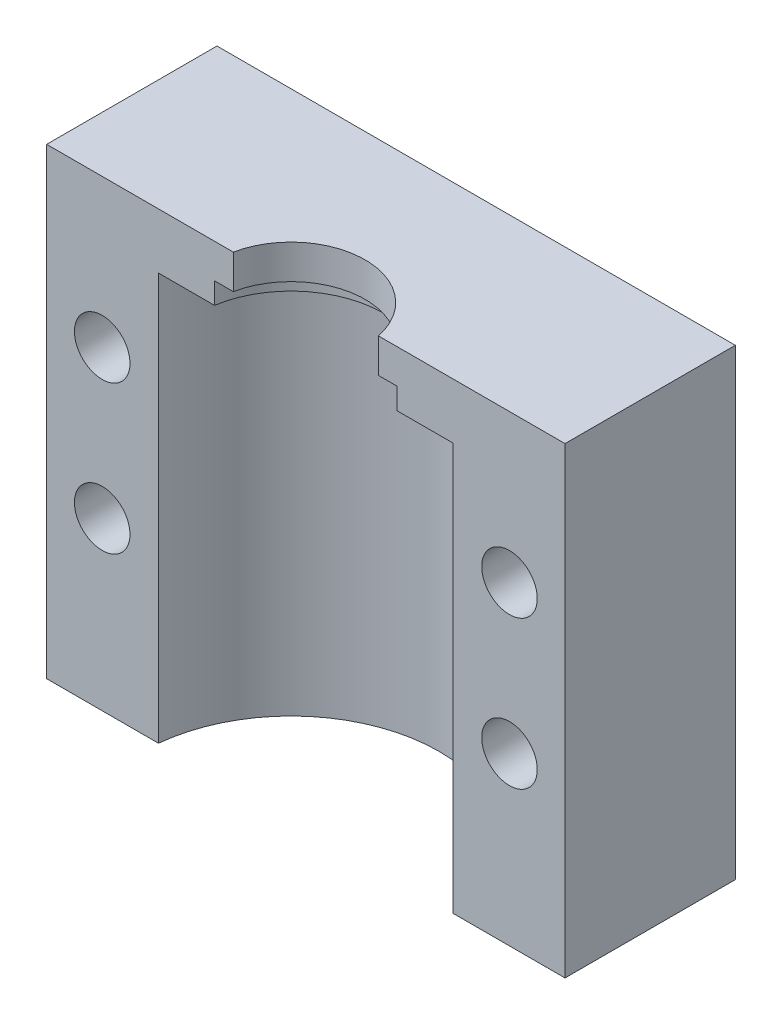
ISO-10303-21;
HEADER;
FILE_DESCRIPTION(('STEP AP214'),'2;1');
FILE_NAME('part.step','',(''),(''),'','','');
FILE_SCHEMA(('AUTOMOTIVE_DESIGN { 1 0 10303 214 1 1 1 1 }'));
ENDSEC;
DATA;
#1=APPLICATION_CONTEXT('core data for automotive mechanical design processes');
#2=APPLICATION_PROTOCOL_DEFINITION('international standard','automotive_design',2000,#1);
#3=PRODUCT_CONTEXT('',#1,'mechanical');
#4=PRODUCT('Part','Part','',(#3));
#5=PRODUCT_RELATED_PRODUCT_CATEGORY('part','',(#4));
#6=PRODUCT_DEFINITION_FORMATION('','',#4);
#7=PRODUCT_DEFINITION_CONTEXT('part definition',#1,'design');
#8=PRODUCT_DEFINITION('design','',#6,#7);
#9=PRODUCT_DEFINITION_SHAPE('','',#8);
#10=(LENGTH_UNIT() NAMED_UNIT(*) SI_UNIT(.MILLI.,.METRE.));
#11=(NAMED_UNIT(*) PLANE_ANGLE_UNIT() SI_UNIT($,.RADIAN.));
#12=(NAMED_UNIT(*) SI_UNIT($,.STERADIAN.) SOLID_ANGLE_UNIT());
#13=UNCERTAINTY_MEASURE_WITH_UNIT(LENGTH_MEASURE(1.E-05),#10,'distance_accuracy_value','');
#14=(GEOMETRIC_REPRESENTATION_CONTEXT(3) GLOBAL_UNCERTAINTY_ASSIGNED_CONTEXT((#13)) GLOBAL_UNIT_ASSIGNED_CONTEXT((#10,
#11,#12)) REPRESENTATION_CONTEXT('',''));
#15=CARTESIAN_POINT('',(0.,0.,0.));
#16=DIRECTION('',(0.,0.,1.));
#17=DIRECTION('',(1.,0.,0.));
#18=AXIS2_PLACEMENT_3D('',#15,#16,#17);
#19=CARTESIAN_POINT('',(0.,0.,10.));
#20=DIRECTION('',(1.,0.,0.));
#21=DIRECTION('',(0.,0.,-1.));
#22=AXIS2_PLACEMENT_3D('',#19,#20,#21);
#23=PLANE('',#22);
#24=DIRECTION('',(0.,-1.,0.));
#25=VECTOR('',#24,1.);
#26=CARTESIAN_POINT('',(0.,25.,9.2));
#27=LINE('',#26,#25);
#28=CARTESIAN_POINT('',(0.,25.,9.2));
#29=VERTEX_POINT('',#28);
#30=CARTESIAN_POINT('',(0.,0.,9.2));
#31=VERTEX_POINT('',#30);
#32=EDGE_CURVE('E116',#29,#31,#27,.T.);
#33=ORIENTED_EDGE('',*,*,#32,.F.);
#34=DIRECTION('',(0.,0.,-1.));
#35=VECTOR('',#34,1.);
#36=CARTESIAN_POINT('',(0.,25.,10.));
#37=LINE('',#36,#35);
#38=CARTESIAN_POINT('',(0.,25.,0.));
#39=VERTEX_POINT('',#38);
#40=EDGE_CURVE('E145',#29,#39,#37,.T.);
#41=ORIENTED_EDGE('',*,*,#40,.T.);
#42=DIRECTION('',(0.,-1.,0.));
#43=VECTOR('',#42,1.);
#44=CARTESIAN_POINT('',(0.,0.,0.));
#45=LINE('',#44,#43);
#46=CARTESIAN_POINT('',(0.,0.,0.));
#47=VERTEX_POINT('',#46);
#48=EDGE_CURVE('E140',#39,#47,#45,.T.);
#49=ORIENTED_EDGE('',*,*,#48,.T.);
#50=DIRECTION('',(0.,0.,-1.));
#51=VECTOR('',#50,1.);
#52=CARTESIAN_POINT('',(0.,0.,10.));
#53=LINE('',#52,#51);
#54=EDGE_CURVE('E131',#31,#47,#53,.T.);
#55=ORIENTED_EDGE('',*,*,#54,.F.);
#56=EDGE_LOOP('',(#33,#41,#49,#55));
#57=FACE_BOUND('',#56,.T.);
#58=ADVANCED_FACE('F39',(#57),#23,.F.);
#59=CARTESIAN_POINT('',(0.,0.,10.));
#60=DIRECTION('',(0.,1.,0.));
#61=DIRECTION('',(0.,0.,1.));
#62=AXIS2_PLACEMENT_3D('',#59,#60,#61);
#63=PLANE('',#62);
#64=DIRECTION('',(1.,0.,0.));
#65=VECTOR('',#64,1.);
#66=CARTESIAN_POINT('',(0.,0.,9.2));
#67=LINE('',#66,#65);
#68=CARTESIAN_POINT('',(6.04010050314704,0.,9.2));
#69=VERTEX_POINT('',#68);
#70=EDGE_CURVE('E119',#31,#69,#67,.T.);
#71=ORIENTED_EDGE('',*,*,#70,.F.);
#72=ORIENTED_EDGE('',*,*,#54,.T.);
#73=DIRECTION('',(1.,0.,0.));
#74=VECTOR('',#73,1.);
#75=CARTESIAN_POINT('',(0.,0.,0.));
#76=LINE('',#75,#74);
#77=CARTESIAN_POINT('',(28.,0.,0.));
#78=VERTEX_POINT('',#77);
#79=EDGE_CURVE('E141',#47,#78,#76,.T.);
#80=ORIENTED_EDGE('',*,*,#79,.T.);
#81=DIRECTION('',(0.,0.,-1.));
#82=VECTOR('',#81,1.);
#83=CARTESIAN_POINT('',(28.,0.,10.));
#84=LINE('',#83,#82);
#85=CARTESIAN_POINT('',(28.,0.,9.2));
#86=VERTEX_POINT('',#85);
#87=EDGE_CURVE('E151',#86,#78,#84,.T.);
#88=ORIENTED_EDGE('',*,*,#87,.F.);
#89=CARTESIAN_POINT('',(21.959899496853,0.,9.2));
#90=VERTEX_POINT('',#89);
#91=EDGE_CURVE('E126',#90,#86,#67,.T.);
#92=ORIENTED_EDGE('',*,*,#91,.F.);
#93=CARTESIAN_POINT('',(14.,0.,10.));
#94=DIRECTION('',(0.,1.,0.));
#95=DIRECTION('',(0.,0.,1.));
#96=AXIS2_PLACEMENT_3D('',#93,#94,#95);
#97=CIRCLE('',#96,8.);
#98=EDGE_CURVE('E135',#90,#69,#97,.T.);
#99=ORIENTED_EDGE('',*,*,#98,.T.);
#100=EDGE_LOOP('',(#71,#72,#80,#88,#92,#99));
#101=FACE_BOUND('',#100,.T.);
#102=ADVANCED_FACE('F41',(#101),#63,.F.);
#103=CARTESIAN_POINT('',(28.,0.,10.));
#104=DIRECTION('',(-1.,0.,0.));
#105=DIRECTION('',(0.,0.,1.));
#106=AXIS2_PLACEMENT_3D('',#103,#104,#105);
#107=PLANE('',#106);
#108=DIRECTION('',(0.,1.,0.));
#109=VECTOR('',#108,1.);
#110=CARTESIAN_POINT('',(28.,25.,9.2));
#111=LINE('',#110,#109);
#112=CARTESIAN_POINT('',(28.,25.,9.2));
#113=VERTEX_POINT('',#112);
#114=EDGE_CURVE('E136',#86,#113,#111,.T.);
#115=ORIENTED_EDGE('',*,*,#114,.F.);
#116=ORIENTED_EDGE('',*,*,#87,.T.);
#117=DIRECTION('',(0.,1.,0.));
#118=VECTOR('',#117,1.);
#119=CARTESIAN_POINT('',(28.,0.,0.));
#120=LINE('',#119,#118);
#121=CARTESIAN_POINT('',(28.,25.,0.));
#122=VERTEX_POINT('',#121);
#123=EDGE_CURVE('E143',#78,#122,#120,.T.);
#124=ORIENTED_EDGE('',*,*,#123,.T.);
#125=DIRECTION('',(0.,0.,-1.));
#126=VECTOR('',#125,1.);
#127=CARTESIAN_POINT('',(28.,25.,10.));
#128=LINE('',#127,#126);
#129=EDGE_CURVE('E154',#113,#122,#128,.T.);
#130=ORIENTED_EDGE('',*,*,#129,.F.);
#131=EDGE_LOOP('',(#115,#116,#124,#130));
#132=FACE_BOUND('',#131,.T.);
#133=ADVANCED_FACE('F249',(#132),#107,.F.);
#134=CARTESIAN_POINT('',(0.,25.,10.));
#135=DIRECTION('',(0.,-1.,0.));
#136=DIRECTION('',(0.,0.,-1.));
#137=AXIS2_PLACEMENT_3D('',#134,#135,#136);
#138=PLANE('',#137);
#139=DIRECTION('',(-1.,0.,0.));
#140=VECTOR('',#139,1.);
#141=CARTESIAN_POINT('',(0.,25.,9.2));
#142=LINE('',#141,#140);
#143=CARTESIAN_POINT('',(17.9191835884531,25.,9.2));
#144=VERTEX_POINT('',#143);
#145=EDGE_CURVE('E56',#113,#144,#142,.T.);
#146=ORIENTED_EDGE('',*,*,#145,.F.);
#147=ORIENTED_EDGE('',*,*,#129,.T.);
#148=DIRECTION('',(-1.,0.,0.));
#149=VECTOR('',#148,1.);
#150=CARTESIAN_POINT('',(0.,25.,0.));
#151=LINE('',#150,#149);
#152=EDGE_CURVE('E156',#122,#39,#151,.T.);
#153=ORIENTED_EDGE('',*,*,#152,.T.);
#154=ORIENTED_EDGE('',*,*,#40,.F.);
#155=CARTESIAN_POINT('',(10.0808164115469,25.,9.2));
#156=VERTEX_POINT('',#155);
#157=EDGE_CURVE('E122',#156,#29,#142,.T.);
#158=ORIENTED_EDGE('',*,*,#157,.F.);
#159=CARTESIAN_POINT('',(14.,25.,10.));
#160=DIRECTION('',(0.,1.,0.));
#161=DIRECTION('',(0.,0.,1.));
#162=AXIS2_PLACEMENT_3D('',#159,#160,#161);
#163=CIRCLE('',#162,4.);
#164=EDGE_CURVE('E153',#156,#144,#163,.F.);
#165=ORIENTED_EDGE('',*,*,#164,.T.);
#166=EDGE_LOOP('',(#146,#147,#153,#154,#158,#165));
#167=FACE_BOUND('',#166,.T.);
#168=ADVANCED_FACE('F244',(#167),#138,.F.);
#169=CARTESIAN_POINT('',(14.,-8.29999999999999,10.));
#170=DIRECTION('',(0.,1.,0.));
#171=DIRECTION('',(0.,0.,1.));
#172=AXIS2_PLACEMENT_3D('',#169,#170,#171);
#173=CYLINDRICAL_SURFACE('',#172,8.);
#174=DIRECTION('',(0.,1.,0.));
#175=VECTOR('',#174,1.);
#176=CARTESIAN_POINT('',(21.959899496853,-8.29999999999999,9.2));
#177=LINE('',#176,#175);
#178=CARTESIAN_POINT('',(21.959899496853,22.,9.2));
#179=VERTEX_POINT('',#178);
#180=EDGE_CURVE('E183',#179,#90,#177,.F.);
#181=ORIENTED_EDGE('',*,*,#180,.F.);
#182=CARTESIAN_POINT('',(14.,22.,10.));
#183=DIRECTION('',(0.,1.,0.));
#184=DIRECTION('',(0.,0.,1.));
#185=AXIS2_PLACEMENT_3D('',#182,#183,#184);
#186=CIRCLE('',#185,8.);
#187=CARTESIAN_POINT('',(6.04010050314704,22.,9.2));
#188=VERTEX_POINT('',#187);
#189=EDGE_CURVE('E160',#188,#179,#186,.F.);
#190=ORIENTED_EDGE('',*,*,#189,.F.);
#191=DIRECTION('',(0.,1.,0.));
#192=VECTOR('',#191,1.);
#193=CARTESIAN_POINT('',(6.04010050314704,-8.29999999999999,9.2));
#194=LINE('',#193,#192);
#195=EDGE_CURVE('E182',#69,#188,#194,.T.);
#196=ORIENTED_EDGE('',*,*,#195,.F.);
#197=ORIENTED_EDGE('',*,*,#98,.F.);
#198=EDGE_LOOP('',(#181,#190,#196,#197));
#199=FACE_BOUND('',#198,.T.);
#200=ADVANCED_FACE('F181',(#199),#173,.F.);
#201=CARTESIAN_POINT('',(14.,22.,10.));
#202=DIRECTION('',(0.,1.,0.));
#203=DIRECTION('',(0.,0.,1.));
#204=AXIS2_PLACEMENT_3D('',#201,#202,#203);
#205=PLANE('',#204);
#206=DIRECTION('',(1.,0.,0.));
#207=VECTOR('',#206,1.);
#208=CARTESIAN_POINT('',(14.,22.,9.2));
#209=LINE('',#208,#207);
#210=CARTESIAN_POINT('',(9.06441492829877,22.,9.2));
#211=VERTEX_POINT('',#210);
#212=EDGE_CURVE('E178',#188,#211,#209,.T.);
#213=ORIENTED_EDGE('',*,*,#212,.F.);
#214=ORIENTED_EDGE('',*,*,#189,.T.);
#215=CARTESIAN_POINT('',(18.9355850717012,22.,9.2));
#216=VERTEX_POINT('',#215);
#217=EDGE_CURVE('E177',#216,#179,#209,.T.);
#218=ORIENTED_EDGE('',*,*,#217,.F.);
#219=CARTESIAN_POINT('',(14.,22.,10.));
#220=DIRECTION('',(0.,1.,0.));
#221=DIRECTION('',(0.,0.,1.));
#222=AXIS2_PLACEMENT_3D('',#219,#220,#221);
#223=CIRCLE('',#222,5.);
#224=EDGE_CURVE('E168',#211,#216,#223,.F.);
#225=ORIENTED_EDGE('',*,*,#224,.F.);
#226=EDGE_LOOP('',(#213,#214,#218,#225));
#227=FACE_BOUND('',#226,.T.);
#228=ADVANCED_FACE('F175',(#227),#205,.F.);
#229=CARTESIAN_POINT('',(14.,-14.13,10.));
#230=DIRECTION('',(0.,1.,0.));
#231=DIRECTION('',(0.,0.,1.));
#232=AXIS2_PLACEMENT_3D('',#229,#230,#231);
#233=CYLINDRICAL_SURFACE('',#232,5.);
#234=DIRECTION('',(0.,1.,0.));
#235=VECTOR('',#234,1.);
#236=CARTESIAN_POINT('',(18.9355850717012,-14.13,9.2));
#237=LINE('',#236,#235);
#238=CARTESIAN_POINT('',(18.9355850717012,23.15,9.2));
#239=VERTEX_POINT('',#238);
#240=EDGE_CURVE('E188',#239,#216,#237,.F.);
#241=ORIENTED_EDGE('',*,*,#240,.F.);
#242=CARTESIAN_POINT('',(14.,23.15,10.));
#243=DIRECTION('',(0.,1.,0.));
#244=DIRECTION('',(0.,0.,1.));
#245=AXIS2_PLACEMENT_3D('',#242,#243,#244);
#246=CIRCLE('',#245,5.);
#247=CARTESIAN_POINT('',(9.06441492829877,23.15,9.2));
#248=VERTEX_POINT('',#247);
#249=EDGE_CURVE('E48',#248,#239,#246,.F.);
#250=ORIENTED_EDGE('',*,*,#249,.F.);
#251=DIRECTION('',(0.,1.,0.));
#252=VECTOR('',#251,1.);
#253=CARTESIAN_POINT('',(9.06441492829877,-14.13,9.2));
#254=LINE('',#253,#252);
#255=EDGE_CURVE('E226',#211,#248,#254,.T.);
#256=ORIENTED_EDGE('',*,*,#255,.F.);
#257=ORIENTED_EDGE('',*,*,#224,.T.);
#258=EDGE_LOOP('',(#241,#250,#256,#257));
#259=FACE_BOUND('',#258,.T.);
#260=ADVANCED_FACE('F235',(#259),#233,.F.);
#261=CARTESIAN_POINT('',(14.,23.15,10.));
#262=DIRECTION('',(0.,1.,0.));
#263=DIRECTION('',(0.,0.,1.));
#264=AXIS2_PLACEMENT_3D('',#261,#262,#263);
#265=PLANE('',#264);
#266=DIRECTION('',(1.,0.,0.));
#267=VECTOR('',#266,1.);
#268=CARTESIAN_POINT('',(14.,23.15,9.2));
#269=LINE('',#268,#267);
#270=CARTESIAN_POINT('',(10.0808164115469,23.15,9.2));
#271=VERTEX_POINT('',#270);
#272=EDGE_CURVE('E64',#248,#271,#269,.T.);
#273=ORIENTED_EDGE('',*,*,#272,.F.);
#274=ORIENTED_EDGE('',*,*,#249,.T.);
#275=CARTESIAN_POINT('',(17.9191835884531,23.15,9.2));
#276=VERTEX_POINT('',#275);
#277=EDGE_CURVE('E227',#276,#239,#269,.T.);
#278=ORIENTED_EDGE('',*,*,#277,.F.);
#279=CARTESIAN_POINT('',(14.,23.15,10.));
#280=DIRECTION('',(0.,1.,0.));
#281=DIRECTION('',(0.,0.,1.));
#282=AXIS2_PLACEMENT_3D('',#279,#280,#281);
#283=CIRCLE('',#282,4.);
#284=EDGE_CURVE('E11',#271,#276,#283,.F.);
#285=ORIENTED_EDGE('',*,*,#284,.F.);
#286=EDGE_LOOP('',(#273,#274,#278,#285));
#287=FACE_BOUND('',#286,.T.);
#288=ADVANCED_FACE('F238',(#287),#265,.F.);
#289=CARTESIAN_POINT('',(14.,-14.13,10.));
#290=DIRECTION('',(0.,1.,0.));
#291=DIRECTION('',(0.,0.,1.));
#292=AXIS2_PLACEMENT_3D('',#289,#290,#291);
#293=CYLINDRICAL_SURFACE('',#292,4.);
#294=DIRECTION('',(0.,1.,0.));
#295=VECTOR('',#294,1.);
#296=CARTESIAN_POINT('',(17.9191835884531,-14.13,9.2));
#297=LINE('',#296,#295);
#298=EDGE_CURVE('E229',#144,#276,#297,.F.);
#299=ORIENTED_EDGE('',*,*,#298,.F.);
#300=ORIENTED_EDGE('',*,*,#164,.F.);
#301=DIRECTION('',(0.,1.,0.));
#302=VECTOR('',#301,1.);
#303=CARTESIAN_POINT('',(10.0808164115469,-14.13,9.2));
#304=LINE('',#303,#302);
#305=EDGE_CURVE('E223',#271,#156,#304,.T.);
#306=ORIENTED_EDGE('',*,*,#305,.F.);
#307=ORIENTED_EDGE('',*,*,#284,.T.);
#308=EDGE_LOOP('',(#299,#300,#306,#307));
#309=FACE_BOUND('',#308,.T.);
#310=ADVANCED_FACE('F241',(#309),#293,.F.);
#311=CARTESIAN_POINT('',(3.,17.,0.));
#312=DIRECTION('',(0.,0.,1.));
#313=DIRECTION('',(1.,0.,0.));
#314=AXIS2_PLACEMENT_3D('',#311,#312,#313);
#315=CYLINDRICAL_SURFACE('',#314,1.5);
#316=CARTESIAN_POINT('',(3.,17.,0.));
#317=DIRECTION('',(0.,0.,1.));
#318=DIRECTION('',(1.,0.,0.));
#319=AXIS2_PLACEMENT_3D('',#316,#317,#318);
#320=CIRCLE('',#319,1.5);
#321=CARTESIAN_POINT('',(4.5,17.,0.));
#322=VERTEX_POINT('',#321);
#323=EDGE_CURVE('E149',#322,#322,#320,.T.);
#324=ORIENTED_EDGE('',*,*,#323,.F.);
#325=EDGE_LOOP('',(#324));
#326=FACE_BOUND('',#325,.T.);
#327=CARTESIAN_POINT('',(3.,17.,9.2));
#328=DIRECTION('',(0.,0.,1.));
#329=DIRECTION('',(1.,0.,0.));
#330=AXIS2_PLACEMENT_3D('',#327,#328,#329);
#331=CIRCLE('',#330,1.5);
#332=CARTESIAN_POINT('',(4.5,17.,9.2));
#333=VERTEX_POINT('',#332);
#334=EDGE_CURVE('E215',#333,#333,#331,.F.);
#335=ORIENTED_EDGE('',*,*,#334,.F.);
#336=EDGE_LOOP('',(#335));
#337=FACE_BOUND('',#336,.T.);
#338=ADVANCED_FACE('F273',(#326,#337),#315,.F.);
#339=CARTESIAN_POINT('',(25.,17.,0.));
#340=DIRECTION('',(0.,0.,1.));
#341=DIRECTION('',(1.,0.,0.));
#342=AXIS2_PLACEMENT_3D('',#339,#340,#341);
#343=CYLINDRICAL_SURFACE('',#342,1.5);
#344=CARTESIAN_POINT('',(25.,17.,0.));
#345=DIRECTION('',(0.,0.,1.));
#346=DIRECTION('',(1.,0.,0.));
#347=AXIS2_PLACEMENT_3D('',#344,#345,#346);
#348=CIRCLE('',#347,1.5);
#349=CARTESIAN_POINT('',(26.5,17.,0.));
#350=VERTEX_POINT('',#349);
#351=EDGE_CURVE('E184',#350,#350,#348,.T.);
#352=ORIENTED_EDGE('',*,*,#351,.F.);
#353=EDGE_LOOP('',(#352));
#354=FACE_BOUND('',#353,.T.);
#355=CARTESIAN_POINT('',(25.,17.,9.2));
#356=DIRECTION('',(0.,0.,1.));
#357=DIRECTION('',(1.,0.,0.));
#358=AXIS2_PLACEMENT_3D('',#355,#356,#357);
#359=CIRCLE('',#358,1.5);
#360=CARTESIAN_POINT('',(26.5,17.,9.2));
#361=VERTEX_POINT('',#360);
#362=EDGE_CURVE('E212',#361,#361,#359,.F.);
#363=ORIENTED_EDGE('',*,*,#362,.F.);
#364=EDGE_LOOP('',(#363));
#365=FACE_BOUND('',#364,.T.);
#366=ADVANCED_FACE('F206',(#354,#365),#343,.F.);
#367=CARTESIAN_POINT('',(25.,9.,0.));
#368=DIRECTION('',(0.,0.,1.));
#369=DIRECTION('',(1.,0.,0.));
#370=AXIS2_PLACEMENT_3D('',#367,#368,#369);
#371=CYLINDRICAL_SURFACE('',#370,1.5);
#372=CARTESIAN_POINT('',(25.,9.,0.));
#373=DIRECTION('',(0.,0.,1.));
#374=DIRECTION('',(1.,0.,0.));
#375=AXIS2_PLACEMENT_3D('',#372,#373,#374);
#376=CIRCLE('',#375,1.5);
#377=CARTESIAN_POINT('',(26.5,9.,0.));
#378=VERTEX_POINT('',#377);
#379=EDGE_CURVE('E187',#378,#378,#376,.T.);
#380=ORIENTED_EDGE('',*,*,#379,.F.);
#381=EDGE_LOOP('',(#380));
#382=FACE_BOUND('',#381,.T.);
#383=CARTESIAN_POINT('',(25.,9.,9.2));
#384=DIRECTION('',(0.,0.,1.));
#385=DIRECTION('',(1.,0.,0.));
#386=AXIS2_PLACEMENT_3D('',#383,#384,#385);
#387=CIRCLE('',#386,1.5);
#388=CARTESIAN_POINT('',(26.5,9.,9.2));
#389=VERTEX_POINT('',#388);
#390=EDGE_CURVE('E210',#389,#389,#387,.F.);
#391=ORIENTED_EDGE('',*,*,#390,.F.);
#392=EDGE_LOOP('',(#391));
#393=FACE_BOUND('',#392,.T.);
#394=ADVANCED_FACE('F202',(#382,#393),#371,.F.);
#395=CARTESIAN_POINT('',(3.,9.,0.));
#396=DIRECTION('',(0.,0.,1.));
#397=DIRECTION('',(1.,0.,0.));
#398=AXIS2_PLACEMENT_3D('',#395,#396,#397);
#399=CYLINDRICAL_SURFACE('',#398,1.5);
#400=CARTESIAN_POINT('',(3.,9.,0.));
#401=DIRECTION('',(0.,0.,1.));
#402=DIRECTION('',(1.,0.,0.));
#403=AXIS2_PLACEMENT_3D('',#400,#401,#402);
#404=CIRCLE('',#403,1.5);
#405=CARTESIAN_POINT('',(4.5,9.,0.));
#406=VERTEX_POINT('',#405);
#407=EDGE_CURVE('E193',#406,#406,#404,.T.);
#408=ORIENTED_EDGE('',*,*,#407,.F.);
#409=EDGE_LOOP('',(#408));
#410=FACE_BOUND('',#409,.T.);
#411=CARTESIAN_POINT('',(3.,9.,9.2));
#412=DIRECTION('',(0.,0.,1.));
#413=DIRECTION('',(1.,0.,0.));
#414=AXIS2_PLACEMENT_3D('',#411,#412,#413);
#415=CIRCLE('',#414,1.5);
#416=CARTESIAN_POINT('',(4.5,9.,9.2));
#417=VERTEX_POINT('',#416);
#418=EDGE_CURVE('E43',#417,#417,#415,.F.);
#419=ORIENTED_EDGE('',*,*,#418,.F.);
#420=EDGE_LOOP('',(#419));
#421=FACE_BOUND('',#420,.T.);
#422=ADVANCED_FACE('F205',(#410,#421),#399,.F.);
#423=CARTESIAN_POINT('',(0.,0.,0.));
#424=DIRECTION('',(0.,0.,-1.));
#425=DIRECTION('',(-1.,0.,0.));
#426=AXIS2_PLACEMENT_3D('',#423,#424,#425);
#427=PLANE('',#426);
#428=ORIENTED_EDGE('',*,*,#407,.T.);
#429=EDGE_LOOP('',(#428));
#430=FACE_BOUND('',#429,.T.);
#431=ORIENTED_EDGE('',*,*,#379,.T.);
#432=EDGE_LOOP('',(#431));
#433=FACE_BOUND('',#432,.T.);
#434=ORIENTED_EDGE('',*,*,#351,.T.);
#435=EDGE_LOOP('',(#434));
#436=FACE_BOUND('',#435,.T.);
#437=ORIENTED_EDGE('',*,*,#323,.T.);
#438=EDGE_LOOP('',(#437));
#439=FACE_BOUND('',#438,.T.);
#440=ORIENTED_EDGE('',*,*,#48,.F.);
#441=ORIENTED_EDGE('',*,*,#152,.F.);
#442=ORIENTED_EDGE('',*,*,#123,.F.);
#443=ORIENTED_EDGE('',*,*,#79,.F.);
#444=EDGE_LOOP('',(#440,#441,#442,#443));
#445=FACE_BOUND('',#444,.T.);
#446=ADVANCED_FACE('F199',(#430,#433,#436,#439,#445),#427,.T.);
#447=CARTESIAN_POINT('',(0.,0.,9.2));
#448=DIRECTION('',(0.,0.,1.));
#449=DIRECTION('',(1.,0.,0.));
#450=AXIS2_PLACEMENT_3D('',#447,#448,#449);
#451=PLANE('',#450);
#452=ORIENTED_EDGE('',*,*,#334,.T.);
#453=EDGE_LOOP('',(#452));
#454=FACE_BOUND('',#453,.T.);
#455=ORIENTED_EDGE('',*,*,#418,.T.);
#456=EDGE_LOOP('',(#455));
#457=FACE_BOUND('',#456,.T.);
#458=ORIENTED_EDGE('',*,*,#195,.T.);
#459=ORIENTED_EDGE('',*,*,#212,.T.);
#460=ORIENTED_EDGE('',*,*,#255,.T.);
#461=ORIENTED_EDGE('',*,*,#272,.T.);
#462=ORIENTED_EDGE('',*,*,#305,.T.);
#463=ORIENTED_EDGE('',*,*,#157,.T.);
#464=ORIENTED_EDGE('',*,*,#32,.T.);
#465=ORIENTED_EDGE('',*,*,#70,.T.);
#466=EDGE_LOOP('',(#458,#459,#460,#461,#462,#463,#464,#465));
#467=FACE_BOUND('',#466,.T.);
#468=ADVANCED_FACE('F118',(#454,#457,#467),#451,.T.);
#469=ORIENTED_EDGE('',*,*,#362,.T.);
#470=EDGE_LOOP('',(#469));
#471=FACE_BOUND('',#470,.T.);
#472=ORIENTED_EDGE('',*,*,#390,.T.);
#473=EDGE_LOOP('',(#472));
#474=FACE_BOUND('',#473,.T.);
#475=ORIENTED_EDGE('',*,*,#180,.T.);
#476=ORIENTED_EDGE('',*,*,#91,.T.);
#477=ORIENTED_EDGE('',*,*,#114,.T.);
#478=ORIENTED_EDGE('',*,*,#145,.T.);
#479=ORIENTED_EDGE('',*,*,#298,.T.);
#480=ORIENTED_EDGE('',*,*,#277,.T.);
#481=ORIENTED_EDGE('',*,*,#240,.T.);
#482=ORIENTED_EDGE('',*,*,#217,.T.);
#483=EDGE_LOOP('',(#475,#476,#477,#478,#479,#480,#481,#482));
#484=FACE_BOUND('',#483,.T.);
#485=ADVANCED_FACE('F232',(#471,#474,#484),#451,.T.);
#486=CLOSED_SHELL('',(#58,#102,#133,#168,#200,#228,#260,#288,#310,#338,#366,#394,#422,#446,#468,#485));
#487=MANIFOLD_SOLID_BREP('B2',#486);
#488=ADVANCED_BREP_SHAPE_REPRESENTATION('',(#18,#487),#14);
#489=SHAPE_DEFINITION_REPRESENTATION(#9,#488);
ENDSEC;
END-ISO-10303-21;
